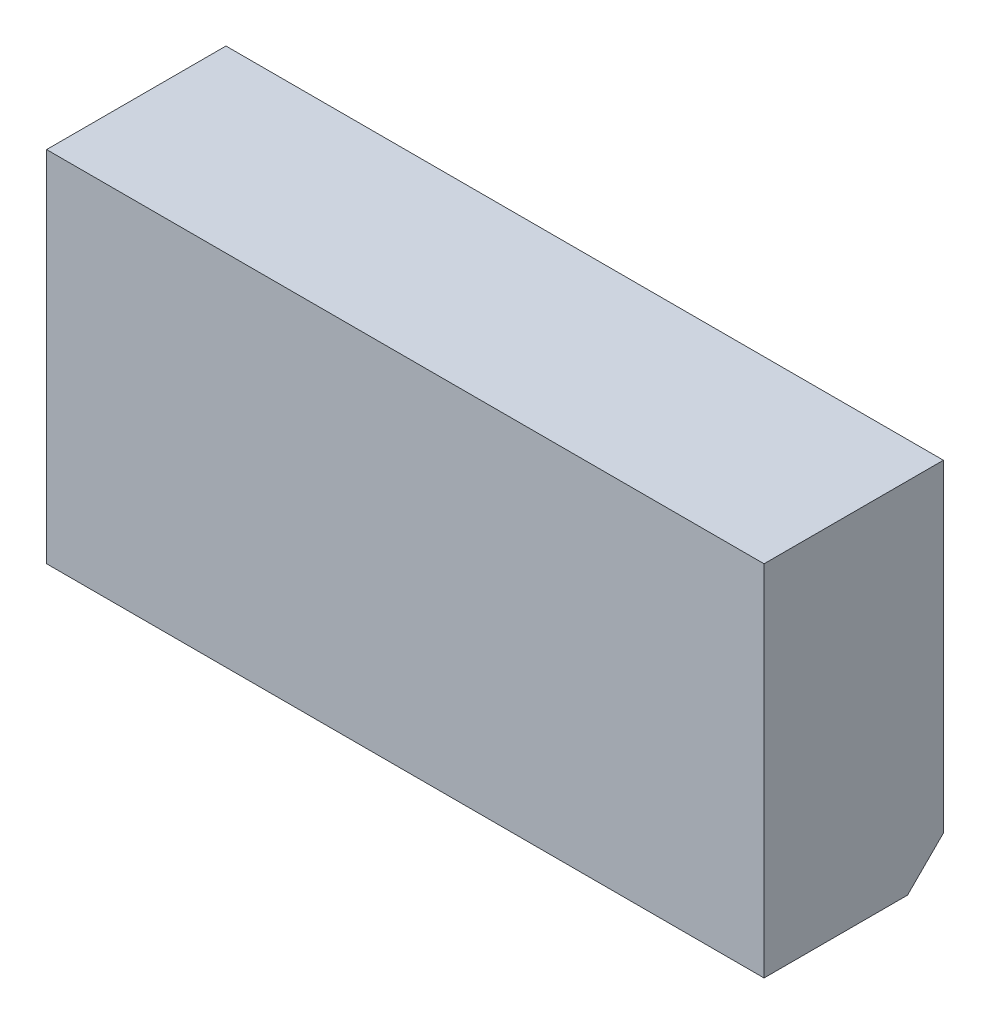
ISO-10303-21;
HEADER;
FILE_DESCRIPTION(('STEP AP214'),'2;1');
FILE_NAME('part.step','',(''),(''),'','','');
FILE_SCHEMA(('AUTOMOTIVE_DESIGN { 1 0 10303 214 1 1 1 1 }'));
ENDSEC;
DATA;
#1=APPLICATION_CONTEXT('core data for automotive mechanical design processes');
#2=APPLICATION_PROTOCOL_DEFINITION('international standard','automotive_design',2000,#1);
#3=PRODUCT_CONTEXT('',#1,'mechanical');
#4=PRODUCT('Part','Part','',(#3));
#5=PRODUCT_RELATED_PRODUCT_CATEGORY('part','',(#4));
#6=PRODUCT_DEFINITION_FORMATION('','',#4);
#7=PRODUCT_DEFINITION_CONTEXT('part definition',#1,'design');
#8=PRODUCT_DEFINITION('design','',#6,#7);
#9=PRODUCT_DEFINITION_SHAPE('','',#8);
#10=(LENGTH_UNIT() NAMED_UNIT(*) SI_UNIT(.MILLI.,.METRE.));
#11=(NAMED_UNIT(*) PLANE_ANGLE_UNIT() SI_UNIT($,.RADIAN.));
#12=(NAMED_UNIT(*) SI_UNIT($,.STERADIAN.) SOLID_ANGLE_UNIT());
#13=UNCERTAINTY_MEASURE_WITH_UNIT(LENGTH_MEASURE(1.E-05),#10,'distance_accuracy_value','');
#14=(GEOMETRIC_REPRESENTATION_CONTEXT(3) GLOBAL_UNCERTAINTY_ASSIGNED_CONTEXT((#13)) GLOBAL_UNIT_ASSIGNED_CONTEXT((#10,
#11,#12)) REPRESENTATION_CONTEXT('',''));
#15=CARTESIAN_POINT('',(0.,0.,0.));
#16=DIRECTION('',(0.,0.,1.));
#17=DIRECTION('',(1.,0.,0.));
#18=AXIS2_PLACEMENT_3D('',#15,#16,#17);
#19=CARTESIAN_POINT('',(0.,20.,10.));
#20=DIRECTION('',(1.,0.,0.));
#21=DIRECTION('',(0.,0.,-1.));
#22=AXIS2_PLACEMENT_3D('',#19,#20,#21);
#23=PLANE('',#22);
#24=DIRECTION('',(0.,-1.,0.));
#25=VECTOR('',#24,1.);
#26=CARTESIAN_POINT('',(0.,20.,0.));
#27=LINE('',#26,#25);
#28=CARTESIAN_POINT('',(0.,20.,0.));
#29=VERTEX_POINT('',#28);
#30=CARTESIAN_POINT('',(0.,2.00000000000001,0.));
#31=VERTEX_POINT('',#30);
#32=EDGE_CURVE('E127',#29,#31,#27,.T.);
#33=ORIENTED_EDGE('',*,*,#32,.T.);
#34=DIRECTION('',(0.,0.707106781186551,-0.707106781186544));
#35=VECTOR('',#34,1.);
#36=CARTESIAN_POINT('',(0.,0.,1.99999999999999));
#37=LINE('',#36,#35);
#38=CARTESIAN_POINT('',(0.,0.,1.99999999999999));
#39=VERTEX_POINT('',#38);
#40=EDGE_CURVE('E11',#31,#39,#37,.F.);
#41=ORIENTED_EDGE('',*,*,#40,.T.);
#42=DIRECTION('',(0.,0.,-1.));
#43=VECTOR('',#42,1.);
#44=CARTESIAN_POINT('',(0.,0.,10.));
#45=LINE('',#44,#43);
#46=CARTESIAN_POINT('',(0.,0.,10.));
#47=VERTEX_POINT('',#46);
#48=EDGE_CURVE('E95',#47,#39,#45,.T.);
#49=ORIENTED_EDGE('',*,*,#48,.F.);
#50=DIRECTION('',(0.,-1.,0.));
#51=VECTOR('',#50,1.);
#52=CARTESIAN_POINT('',(0.,20.,10.));
#53=LINE('',#52,#51);
#54=CARTESIAN_POINT('',(0.,20.,10.));
#55=VERTEX_POINT('',#54);
#56=EDGE_CURVE('E101',#55,#47,#53,.T.);
#57=ORIENTED_EDGE('',*,*,#56,.F.);
#58=DIRECTION('',(0.,0.,-1.));
#59=VECTOR('',#58,1.);
#60=CARTESIAN_POINT('',(0.,20.,10.));
#61=LINE('',#60,#59);
#62=EDGE_CURVE('E122',#55,#29,#61,.T.);
#63=ORIENTED_EDGE('',*,*,#62,.T.);
#64=EDGE_LOOP('',(#33,#41,#49,#57,#63));
#65=FACE_BOUND('',#64,.T.);
#66=ADVANCED_FACE('F43',(#65),#23,.F.);
#67=CARTESIAN_POINT('',(0.,0.,10.));
#68=DIRECTION('',(0.,1.,0.));
#69=DIRECTION('',(0.,0.,1.));
#70=AXIS2_PLACEMENT_3D('',#67,#68,#69);
#71=PLANE('',#70);
#72=ORIENTED_EDGE('',*,*,#48,.T.);
#73=DIRECTION('',(1.,0.,0.));
#74=VECTOR('',#73,1.);
#75=CARTESIAN_POINT('',(0.,0.,1.99999999999999));
#76=LINE('',#75,#74);
#77=CARTESIAN_POINT('',(40.,0.,1.99999999999999));
#78=VERTEX_POINT('',#77);
#79=EDGE_CURVE('E113',#39,#78,#76,.T.);
#80=ORIENTED_EDGE('',*,*,#79,.T.);
#81=DIRECTION('',(0.,0.,-1.));
#82=VECTOR('',#81,1.);
#83=CARTESIAN_POINT('',(40.,0.,10.));
#84=LINE('',#83,#82);
#85=CARTESIAN_POINT('',(40.,0.,10.));
#86=VERTEX_POINT('',#85);
#87=EDGE_CURVE('E97',#86,#78,#84,.T.);
#88=ORIENTED_EDGE('',*,*,#87,.F.);
#89=DIRECTION('',(1.,0.,0.));
#90=VECTOR('',#89,1.);
#91=CARTESIAN_POINT('',(0.,0.,10.));
#92=LINE('',#91,#90);
#93=EDGE_CURVE('E90',#47,#86,#92,.T.);
#94=ORIENTED_EDGE('',*,*,#93,.F.);
#95=EDGE_LOOP('',(#72,#80,#88,#94));
#96=FACE_BOUND('',#95,.T.);
#97=ADVANCED_FACE('F92',(#96),#71,.F.);
#98=CARTESIAN_POINT('',(40.,0.,10.));
#99=DIRECTION('',(-1.,0.,0.));
#100=DIRECTION('',(0.,0.,1.));
#101=AXIS2_PLACEMENT_3D('',#98,#99,#100);
#102=PLANE('',#101);
#103=ORIENTED_EDGE('',*,*,#87,.T.);
#104=DIRECTION('',(0.,-0.707106781186551,0.707106781186544));
#105=VECTOR('',#104,1.);
#106=CARTESIAN_POINT('',(40.,0.,1.99999999999999));
#107=LINE('',#106,#105);
#108=CARTESIAN_POINT('',(40.,2.00000000000001,0.));
#109=VERTEX_POINT('',#108);
#110=EDGE_CURVE('E66',#78,#109,#107,.F.);
#111=ORIENTED_EDGE('',*,*,#110,.T.);
#112=DIRECTION('',(0.,1.,0.));
#113=VECTOR('',#112,1.);
#114=CARTESIAN_POINT('',(40.,0.,0.));
#115=LINE('',#114,#113);
#116=CARTESIAN_POINT('',(40.,20.,0.));
#117=VERTEX_POINT('',#116);
#118=EDGE_CURVE('E125',#109,#117,#115,.T.);
#119=ORIENTED_EDGE('',*,*,#118,.T.);
#120=DIRECTION('',(0.,0.,-1.));
#121=VECTOR('',#120,1.);
#122=CARTESIAN_POINT('',(40.,20.,10.));
#123=LINE('',#122,#121);
#124=CARTESIAN_POINT('',(40.,20.,10.));
#125=VERTEX_POINT('',#124);
#126=EDGE_CURVE('E116',#125,#117,#123,.T.);
#127=ORIENTED_EDGE('',*,*,#126,.F.);
#128=DIRECTION('',(0.,1.,0.));
#129=VECTOR('',#128,1.);
#130=CARTESIAN_POINT('',(40.,0.,10.));
#131=LINE('',#130,#129);
#132=EDGE_CURVE('E100',#86,#125,#131,.T.);
#133=ORIENTED_EDGE('',*,*,#132,.F.);
#134=EDGE_LOOP('',(#103,#111,#119,#127,#133));
#135=FACE_BOUND('',#134,.T.);
#136=ADVANCED_FACE('F131',(#135),#102,.F.);
#137=CARTESIAN_POINT('',(40.,20.,10.));
#138=DIRECTION('',(0.,-1.,0.));
#139=DIRECTION('',(0.,0.,-1.));
#140=AXIS2_PLACEMENT_3D('',#137,#138,#139);
#141=PLANE('',#140);
#142=DIRECTION('',(-1.,0.,0.));
#143=VECTOR('',#142,1.);
#144=CARTESIAN_POINT('',(40.,20.,0.));
#145=LINE('',#144,#143);
#146=EDGE_CURVE('E110',#117,#29,#145,.T.);
#147=ORIENTED_EDGE('',*,*,#146,.T.);
#148=ORIENTED_EDGE('',*,*,#62,.F.);
#149=DIRECTION('',(-1.,0.,0.));
#150=VECTOR('',#149,1.);
#151=CARTESIAN_POINT('',(40.,20.,10.));
#152=LINE('',#151,#150);
#153=EDGE_CURVE('E106',#125,#55,#152,.T.);
#154=ORIENTED_EDGE('',*,*,#153,.F.);
#155=ORIENTED_EDGE('',*,*,#126,.T.);
#156=EDGE_LOOP('',(#147,#148,#154,#155));
#157=FACE_BOUND('',#156,.T.);
#158=ADVANCED_FACE('F134',(#157),#141,.F.);
#159=CARTESIAN_POINT('',(0.,0.,10.));
#160=DIRECTION('',(0.,0.,1.));
#161=DIRECTION('',(1.,0.,0.));
#162=AXIS2_PLACEMENT_3D('',#159,#160,#161);
#163=PLANE('',#162);
#164=ORIENTED_EDGE('',*,*,#56,.T.);
#165=ORIENTED_EDGE('',*,*,#93,.T.);
#166=ORIENTED_EDGE('',*,*,#132,.T.);
#167=ORIENTED_EDGE('',*,*,#153,.T.);
#168=EDGE_LOOP('',(#164,#165,#166,#167));
#169=FACE_BOUND('',#168,.T.);
#170=ADVANCED_FACE('F104',(#169),#163,.T.);
#171=CARTESIAN_POINT('',(0.,0.,0.));
#172=DIRECTION('',(0.,0.,1.));
#173=DIRECTION('',(1.,0.,0.));
#174=AXIS2_PLACEMENT_3D('',#171,#172,#173);
#175=PLANE('',#174);
#176=ORIENTED_EDGE('',*,*,#118,.F.);
#177=DIRECTION('',(-1.,0.,0.));
#178=VECTOR('',#177,1.);
#179=CARTESIAN_POINT('',(0.,2.00000000000001,0.));
#180=LINE('',#179,#178);
#181=EDGE_CURVE('E52',#109,#31,#180,.T.);
#182=ORIENTED_EDGE('',*,*,#181,.T.);
#183=ORIENTED_EDGE('',*,*,#32,.F.);
#184=ORIENTED_EDGE('',*,*,#146,.F.);
#185=EDGE_LOOP('',(#176,#182,#183,#184));
#186=FACE_BOUND('',#185,.T.);
#187=ADVANCED_FACE('F135',(#186),#175,.F.);
#188=CARTESIAN_POINT('',(0.,0.,1.99999999999999));
#189=DIRECTION('',(0.,0.707106781186544,0.707106781186551));
#190=DIRECTION('',(1.,0.,0.));
#191=AXIS2_PLACEMENT_3D('',#188,#189,#190);
#192=PLANE('',#191);
#193=ORIENTED_EDGE('',*,*,#40,.F.);
#194=ORIENTED_EDGE('',*,*,#181,.F.);
#195=ORIENTED_EDGE('',*,*,#110,.F.);
#196=ORIENTED_EDGE('',*,*,#79,.F.);
#197=EDGE_LOOP('',(#193,#194,#195,#196));
#198=FACE_BOUND('',#197,.T.);
#199=ADVANCED_FACE('F46',(#198),#192,.F.);
#200=CLOSED_SHELL('',(#66,#97,#136,#158,#170,#187,#199));
#201=MANIFOLD_SOLID_BREP('B2',#200);
#202=ADVANCED_BREP_SHAPE_REPRESENTATION('',(#18,#201),#14);
#203=SHAPE_DEFINITION_REPRESENTATION(#9,#202);
ENDSEC;
END-ISO-10303-21;
